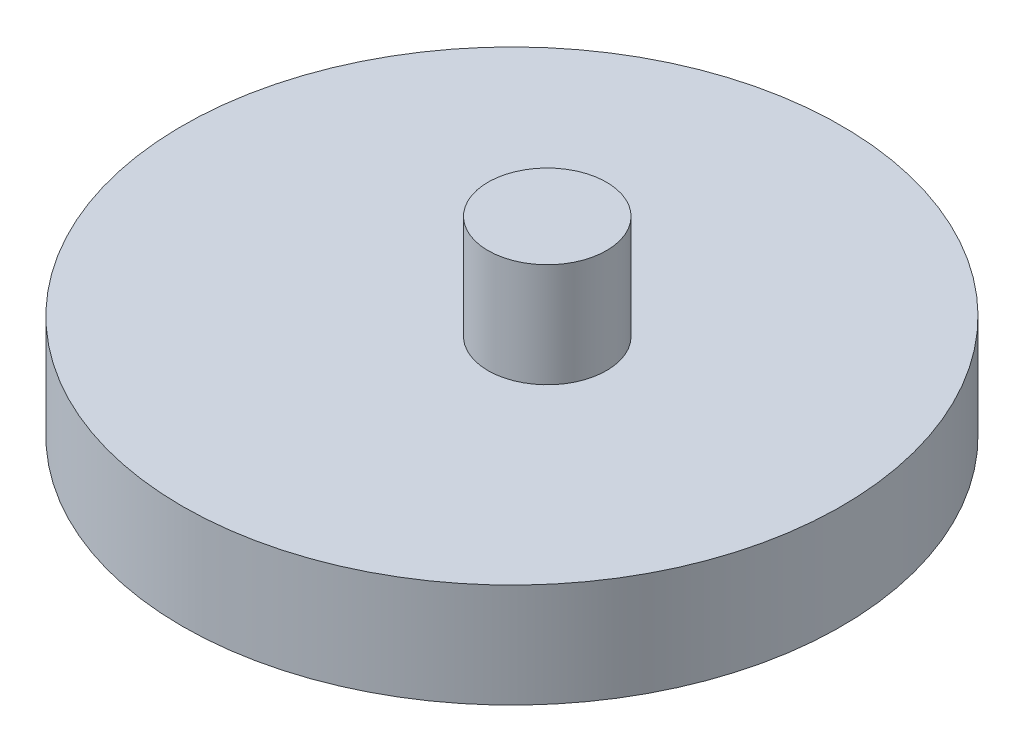
ISO-10303-21;
HEADER;
FILE_DESCRIPTION(('STEP AP214'),'2;1');
FILE_NAME('part.step','',(''),(''),'','','');
FILE_SCHEMA(('AUTOMOTIVE_DESIGN { 1 0 10303 214 1 1 1 1 }'));
ENDSEC;
DATA;
#1=APPLICATION_CONTEXT('core data for automotive mechanical design processes');
#2=APPLICATION_PROTOCOL_DEFINITION('international standard','automotive_design',2000,#1);
#3=PRODUCT_CONTEXT('',#1,'mechanical');
#4=PRODUCT('Part','Part','',(#3));
#5=PRODUCT_RELATED_PRODUCT_CATEGORY('part','',(#4));
#6=PRODUCT_DEFINITION_FORMATION('','',#4);
#7=PRODUCT_DEFINITION_CONTEXT('part definition',#1,'design');
#8=PRODUCT_DEFINITION('design','',#6,#7);
#9=PRODUCT_DEFINITION_SHAPE('','',#8);
#10=(LENGTH_UNIT() NAMED_UNIT(*) SI_UNIT(.MILLI.,.METRE.));
#11=(NAMED_UNIT(*) PLANE_ANGLE_UNIT() SI_UNIT($,.RADIAN.));
#12=(NAMED_UNIT(*) SI_UNIT($,.STERADIAN.) SOLID_ANGLE_UNIT());
#13=UNCERTAINTY_MEASURE_WITH_UNIT(LENGTH_MEASURE(1.E-05),#10,'distance_accuracy_value','');
#14=(GEOMETRIC_REPRESENTATION_CONTEXT(3) GLOBAL_UNCERTAINTY_ASSIGNED_CONTEXT((#13)) GLOBAL_UNIT_ASSIGNED_CONTEXT((#10,
#11,#12)) REPRESENTATION_CONTEXT('',''));
#15=CARTESIAN_POINT('',(0.,0.,0.));
#16=DIRECTION('',(0.,0.,1.));
#17=DIRECTION('',(1.,0.,0.));
#18=AXIS2_PLACEMENT_3D('',#15,#16,#17);
#19=CARTESIAN_POINT('',(0.,6.35,0.));
#20=DIRECTION('',(0.,-1.,0.));
#21=DIRECTION('',(0.,0.,-1.));
#22=AXIS2_PLACEMENT_3D('',#19,#20,#21);
#23=CYLINDRICAL_SURFACE('',#22,20.1295);
#24=CARTESIAN_POINT('',(0.,6.35,0.));
#25=DIRECTION('',(0.,1.,0.));
#26=DIRECTION('',(0.,0.,1.));
#27=AXIS2_PLACEMENT_3D('',#24,#25,#26);
#28=CIRCLE('',#27,20.1295);
#29=CARTESIAN_POINT('',(0.,6.35,20.1295));
#30=VERTEX_POINT('',#29);
#31=EDGE_CURVE('E10',#30,#30,#28,.T.);
#32=ORIENTED_EDGE('',*,*,#31,.F.);
#33=EDGE_LOOP('',(#32));
#34=FACE_BOUND('',#33,.T.);
#35=CARTESIAN_POINT('',(0.,0.,0.));
#36=DIRECTION('',(0.,1.,0.));
#37=DIRECTION('',(0.,0.,1.));
#38=AXIS2_PLACEMENT_3D('',#35,#36,#37);
#39=CIRCLE('',#38,20.1295);
#40=CARTESIAN_POINT('',(0.,0.,20.1295));
#41=VERTEX_POINT('',#40);
#42=EDGE_CURVE('E46',#41,#41,#39,.T.);
#43=ORIENTED_EDGE('',*,*,#42,.T.);
#44=EDGE_LOOP('',(#43));
#45=FACE_BOUND('',#44,.T.);
#46=ADVANCED_FACE('F43',(#34,#45),#23,.T.);
#47=CARTESIAN_POINT('',(0.,6.35,0.));
#48=DIRECTION('',(0.,1.,0.));
#49=DIRECTION('',(0.,0.,1.));
#50=AXIS2_PLACEMENT_3D('',#47,#48,#49);
#51=PLANE('',#50);
#52=CARTESIAN_POINT('',(2.159,6.35,0.));
#53=DIRECTION('',(0.,1.,0.));
#54=DIRECTION('',(0.,0.,1.));
#55=AXIS2_PLACEMENT_3D('',#52,#53,#54);
#56=CIRCLE('',#55,3.6195);
#57=CARTESIAN_POINT('',(2.159,6.35,3.6195));
#58=VERTEX_POINT('',#57);
#59=EDGE_CURVE('E57',#58,#58,#56,.T.);
#60=ORIENTED_EDGE('',*,*,#59,.F.);
#61=EDGE_LOOP('',(#60));
#62=FACE_BOUND('',#61,.T.);
#63=ORIENTED_EDGE('',*,*,#31,.T.);
#64=EDGE_LOOP('',(#63));
#65=FACE_BOUND('',#64,.T.);
#66=ADVANCED_FACE('F74',(#62,#65),#51,.T.);
#67=CARTESIAN_POINT('',(0.,0.,0.));
#68=DIRECTION('',(0.,1.,0.));
#69=DIRECTION('',(0.,0.,1.));
#70=AXIS2_PLACEMENT_3D('',#67,#68,#69);
#71=PLANE('',#70);
#72=ORIENTED_EDGE('',*,*,#42,.F.);
#73=EDGE_LOOP('',(#72));
#74=FACE_BOUND('',#73,.T.);
#75=ADVANCED_FACE('F70',(#74),#71,.F.);
#76=CARTESIAN_POINT('',(2.159,12.7,0.));
#77=DIRECTION('',(0.,-1.,0.));
#78=DIRECTION('',(0.,0.,-1.));
#79=AXIS2_PLACEMENT_3D('',#76,#77,#78);
#80=CYLINDRICAL_SURFACE('',#79,3.6195);
#81=CARTESIAN_POINT('',(2.159,12.7,0.));
#82=DIRECTION('',(0.,1.,0.));
#83=DIRECTION('',(0.,0.,1.));
#84=AXIS2_PLACEMENT_3D('',#81,#82,#83);
#85=CIRCLE('',#84,3.6195);
#86=CARTESIAN_POINT('',(2.159,12.7,3.6195));
#87=VERTEX_POINT('',#86);
#88=EDGE_CURVE('E55',#87,#87,#85,.T.);
#89=ORIENTED_EDGE('',*,*,#88,.F.);
#90=EDGE_LOOP('',(#89));
#91=FACE_BOUND('',#90,.T.);
#92=ORIENTED_EDGE('',*,*,#59,.T.);
#93=EDGE_LOOP('',(#92));
#94=FACE_BOUND('',#93,.T.);
#95=ADVANCED_FACE('F67',(#91,#94),#80,.T.);
#96=CARTESIAN_POINT('',(2.159,12.7,0.));
#97=DIRECTION('',(0.,1.,0.));
#98=DIRECTION('',(0.,0.,1.));
#99=AXIS2_PLACEMENT_3D('',#96,#97,#98);
#100=PLANE('',#99);
#101=ORIENTED_EDGE('',*,*,#88,.T.);
#102=EDGE_LOOP('',(#101));
#103=FACE_BOUND('',#102,.T.);
#104=ADVANCED_FACE('F65',(#103),#100,.T.);
#105=CLOSED_SHELL('',(#46,#66,#75,#95,#104));
#106=MANIFOLD_SOLID_BREP('B2',#105);
#107=ADVANCED_BREP_SHAPE_REPRESENTATION('',(#18,#106),#14);
#108=SHAPE_DEFINITION_REPRESENTATION(#9,#107);
ENDSEC;
END-ISO-10303-21;
